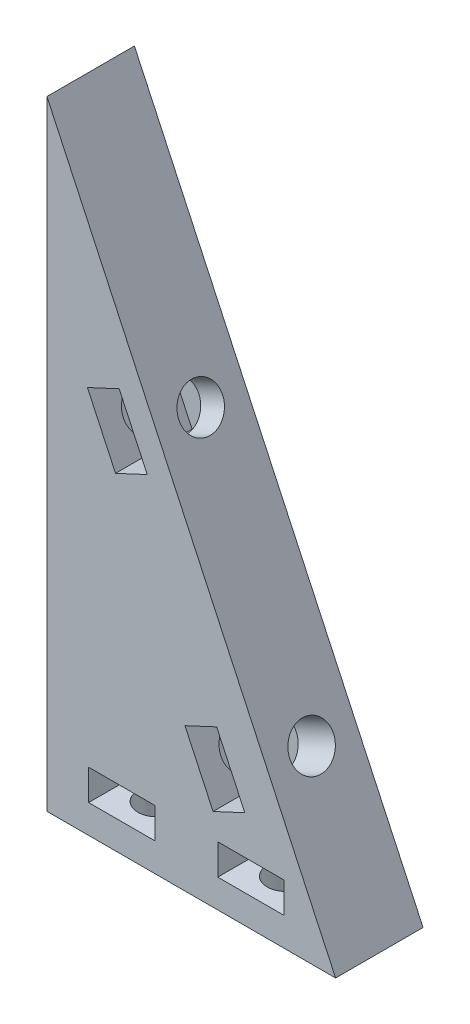
ISO-10303-21;
HEADER;
FILE_DESCRIPTION(('STEP AP214'),'2;1');
FILE_NAME('part.step','',(''),(''),'','','');
FILE_SCHEMA(('AUTOMOTIVE_DESIGN { 1 0 10303 214 1 1 1 1 }'));
ENDSEC;
DATA;
#1=APPLICATION_CONTEXT('core data for automotive mechanical design processes');
#2=APPLICATION_PROTOCOL_DEFINITION('international standard','automotive_design',2000,#1);
#3=PRODUCT_CONTEXT('',#1,'mechanical');
#4=PRODUCT('Part','Part','',(#3));
#5=PRODUCT_RELATED_PRODUCT_CATEGORY('part','',(#4));
#6=PRODUCT_DEFINITION_FORMATION('','',#4);
#7=PRODUCT_DEFINITION_CONTEXT('part definition',#1,'design');
#8=PRODUCT_DEFINITION('design','',#6,#7);
#9=PRODUCT_DEFINITION_SHAPE('','',#8);
#10=(LENGTH_UNIT() NAMED_UNIT(*) SI_UNIT(.MILLI.,.METRE.));
#11=(NAMED_UNIT(*) PLANE_ANGLE_UNIT() SI_UNIT($,.RADIAN.));
#12=(NAMED_UNIT(*) SI_UNIT($,.STERADIAN.) SOLID_ANGLE_UNIT());
#13=UNCERTAINTY_MEASURE_WITH_UNIT(LENGTH_MEASURE(1.E-05),#10,'distance_accuracy_value','');
#14=(GEOMETRIC_REPRESENTATION_CONTEXT(3) GLOBAL_UNCERTAINTY_ASSIGNED_CONTEXT((#13)) GLOBAL_UNIT_ASSIGNED_CONTEXT((#10,
#11,#12)) REPRESENTATION_CONTEXT('',''));
#15=CARTESIAN_POINT('',(0.,0.,0.));
#16=DIRECTION('',(0.,0.,1.));
#17=DIRECTION('',(1.,0.,0.));
#18=AXIS2_PLACEMENT_3D('',#15,#16,#17);
#19=CARTESIAN_POINT('',(0.,0.,10.));
#20=DIRECTION('',(0.,0.,-1.));
#21=DIRECTION('',(-1.,0.,0.));
#22=AXIS2_PLACEMENT_3D('',#19,#20,#21);
#23=PLANE('',#22);
#24=DIRECTION('',(0.,-1.,0.));
#25=VECTOR('',#24,1.);
#26=CARTESIAN_POINT('',(12.3679115650385,0.,10.));
#27=LINE('',#26,#25);
#28=CARTESIAN_POINT('',(12.3679115650385,6.75172864189274,10.));
#29=VERTEX_POINT('',#28);
#30=CARTESIAN_POINT('',(12.3679115650385,3.25172864189274,10.));
#31=VERTEX_POINT('',#30);
#32=EDGE_CURVE('E309',#29,#31,#27,.T.);
#33=ORIENTED_EDGE('',*,*,#32,.T.);
#34=DIRECTION('',(-1.,0.,0.));
#35=VECTOR('',#34,1.);
#36=CARTESIAN_POINT('',(0.,3.25172864189274,10.));
#37=LINE('',#36,#35);
#38=CARTESIAN_POINT('',(4.76791156503854,3.25172864189274,10.));
#39=VERTEX_POINT('',#38);
#40=EDGE_CURVE('E315',#31,#39,#37,.T.);
#41=ORIENTED_EDGE('',*,*,#40,.T.);
#42=DIRECTION('',(0.,1.,0.));
#43=VECTOR('',#42,1.);
#44=CARTESIAN_POINT('',(4.76791156503854,0.,10.));
#45=LINE('',#44,#43);
#46=CARTESIAN_POINT('',(4.76791156503854,6.75172864189274,10.));
#47=VERTEX_POINT('',#46);
#48=EDGE_CURVE('E332',#39,#47,#45,.T.);
#49=ORIENTED_EDGE('',*,*,#48,.T.);
#50=DIRECTION('',(1.,0.,0.));
#51=VECTOR('',#50,1.);
#52=CARTESIAN_POINT('',(0.,6.75172864189274,10.));
#53=LINE('',#52,#51);
#54=EDGE_CURVE('E328',#47,#29,#53,.T.);
#55=ORIENTED_EDGE('',*,*,#54,.T.);
#56=EDGE_LOOP('',(#33,#41,#49,#55));
#57=FACE_BOUND('',#56,.T.);
#58=DIRECTION('',(-0.422618261740704,0.906307787036648,0.));
#59=VECTOR('',#58,1.);
#60=CARTESIAN_POINT('',(33.,0.,10.));
#61=LINE('',#60,#59);
#62=CARTESIAN_POINT('',(33.,0.,10.));
#63=VERTEX_POINT('',#62);
#64=CARTESIAN_POINT('',(0.,70.7687283768145,10.));
#65=VERTEX_POINT('',#64);
#66=EDGE_CURVE('E461',#63,#65,#61,.T.);
#67=ORIENTED_EDGE('',*,*,#66,.T.);
#68=DIRECTION('',(0.,-1.,0.));
#69=VECTOR('',#68,1.);
#70=CARTESIAN_POINT('',(0.,70.7687283768145,10.));
#71=LINE('',#70,#69);
#72=CARTESIAN_POINT('',(0.,0.,10.));
#73=VERTEX_POINT('',#72);
#74=EDGE_CURVE('E465',#65,#73,#71,.T.);
#75=ORIENTED_EDGE('',*,*,#74,.T.);
#76=DIRECTION('',(1.,0.,0.));
#77=VECTOR('',#76,1.);
#78=CARTESIAN_POINT('',(0.,0.,10.));
#79=LINE('',#78,#77);
#80=EDGE_CURVE('E469',#73,#63,#79,.T.);
#81=ORIENTED_EDGE('',*,*,#80,.T.);
#82=EDGE_LOOP('',(#67,#75,#81));
#83=FACE_BOUND('',#82,.T.);
#84=DIRECTION('',(1.,0.,0.));
#85=VECTOR('',#84,1.);
#86=CARTESIAN_POINT('',(0.,6.75172864189275,10.));
#87=LINE('',#86,#85);
#88=CARTESIAN_POINT('',(19.53,6.75172864189274,10.));
#89=VERTEX_POINT('',#88);
#90=CARTESIAN_POINT('',(27.13,6.75172864189274,10.));
#91=VERTEX_POINT('',#90);
#92=EDGE_CURVE('E368',#89,#91,#87,.T.);
#93=ORIENTED_EDGE('',*,*,#92,.T.);
#94=DIRECTION('',(0.,-1.,0.));
#95=VECTOR('',#94,1.);
#96=CARTESIAN_POINT('',(27.13,0.,10.));
#97=LINE('',#96,#95);
#98=CARTESIAN_POINT('',(27.13,3.25172864189274,10.));
#99=VERTEX_POINT('',#98);
#100=EDGE_CURVE('E372',#91,#99,#97,.T.);
#101=ORIENTED_EDGE('',*,*,#100,.T.);
#102=DIRECTION('',(-1.,0.,0.));
#103=VECTOR('',#102,1.);
#104=CARTESIAN_POINT('',(0.,3.25172864189274,10.));
#105=LINE('',#104,#103);
#106=CARTESIAN_POINT('',(19.53,3.25172864189274,10.));
#107=VERTEX_POINT('',#106);
#108=EDGE_CURVE('E377',#99,#107,#105,.T.);
#109=ORIENTED_EDGE('',*,*,#108,.T.);
#110=DIRECTION('',(0.,1.,0.));
#111=VECTOR('',#110,1.);
#112=CARTESIAN_POINT('',(19.53,0.,10.));
#113=LINE('',#112,#111);
#114=EDGE_CURVE('E358',#107,#89,#113,.T.);
#115=ORIENTED_EDGE('',*,*,#114,.T.);
#116=EDGE_LOOP('',(#93,#101,#109,#115));
#117=FACE_BOUND('',#116,.T.);
#118=DIRECTION('',(0.422618261740704,-0.906307787036648,0.));
#119=VECTOR('',#118,1.);
#120=CARTESIAN_POINT('',(19.2322650192959,8.96815246216427,10.));
#121=LINE('',#120,#119);
#122=CARTESIAN_POINT('',(15.7802135690953,16.3711006870743,10.));
#123=VERTEX_POINT('',#122);
#124=CARTESIAN_POINT('',(18.9921123583246,9.48316150559582,10.));
#125=VERTEX_POINT('',#124);
#126=EDGE_CURVE('E283',#123,#125,#121,.T.);
#127=ORIENTED_EDGE('',*,*,#126,.F.);
#128=DIRECTION('',(-0.906307787036648,-0.422618261740703,0.));
#129=VECTOR('',#128,1.);
#130=CARTESIAN_POINT('',(-3.45205145020057,7.40294822491009,10.));
#131=LINE('',#130,#129);
#132=CARTESIAN_POINT('',(19.4054447172419,18.0615737340372,10.));
#133=VERTEX_POINT('',#132);
#134=EDGE_CURVE('E67',#133,#123,#131,.T.);
#135=ORIENTED_EDGE('',*,*,#134,.F.);
#136=DIRECTION('',(-0.422618261740704,0.906307787036648,0.));
#137=VECTOR('',#136,1.);
#138=CARTESIAN_POINT('',(22.8574961674425,10.6586255091271,10.));
#139=LINE('',#138,#137);
#140=CARTESIAN_POINT('',(22.6173435064713,11.1736345525587,10.));
#141=VERTEX_POINT('',#140);
#142=EDGE_CURVE('E269',#141,#133,#139,.T.);
#143=ORIENTED_EDGE('',*,*,#142,.F.);
#144=DIRECTION('',(-0.906307787036646,-0.422618261740707,0.));
#145=VECTOR('',#144,1.);
#146=CARTESIAN_POINT('',(-0.240152660971188,0.515009043431487,10.));
#147=LINE('',#146,#145);
#148=EDGE_CURVE('E288',#141,#125,#147,.T.);
#149=ORIENTED_EDGE('',*,*,#148,.T.);
#150=EDGE_LOOP('',(#127,#135,#143,#149));
#151=FACE_BOUND('',#150,.T.);
#152=DIRECTION('',(0.422618261740717,-0.906307787036642,0.));
#153=VECTOR('',#152,1.);
#154=CARTESIAN_POINT('',(24.3870721987181,11.3718785262417,10.));
#155=LINE('',#154,#153);
#156=CARTESIAN_POINT('',(8.25647289629605,45.9640603622506,10.));
#157=VERTEX_POINT('',#156);
#158=CARTESIAN_POINT('',(11.4683716855255,39.0761211807721,10.));
#159=VERTEX_POINT('',#158);
#160=EDGE_CURVE('E59',#157,#159,#155,.T.);
#161=ORIENTED_EDGE('',*,*,#160,.T.);
#162=DIRECTION('',(0.906307787036644,0.422618261740713,0.));
#163=VECTOR('',#162,1.);
#164=CARTESIAN_POINT('',(-12.9187005131925,27.7042426545306,10.));
#165=LINE('',#164,#163);
#166=CARTESIAN_POINT('',(7.84314053737891,37.3856481338093,10.));
#167=VERTEX_POINT('',#166);
#168=EDGE_CURVE('E229',#167,#159,#165,.T.);
#169=ORIENTED_EDGE('',*,*,#168,.F.);
#170=DIRECTION('',(0.422618261740721,-0.90630778703664,0.));
#171=VECTOR('',#170,1.);
#172=CARTESIAN_POINT('',(20.7618410505716,9.68140547927894,10.));
#173=LINE('',#172,#171);
#174=CARTESIAN_POINT('',(4.63124174814944,44.2735873152877,10.));
#175=VERTEX_POINT('',#174);
#176=EDGE_CURVE('E248',#175,#167,#173,.T.);
#177=ORIENTED_EDGE('',*,*,#176,.F.);
#178=DIRECTION('',(-0.906307787036644,-0.422618261740711,0.));
#179=VECTOR('',#178,1.);
#180=CARTESIAN_POINT('',(-16.1305993024219,34.5921818360092,10.));
#181=LINE('',#180,#179);
#182=EDGE_CURVE('E244',#157,#175,#181,.T.);
#183=ORIENTED_EDGE('',*,*,#182,.F.);
#184=EDGE_LOOP('',(#161,#169,#177,#183));
#185=FACE_BOUND('',#184,.T.);
#186=ADVANCED_FACE('F41',(#57,#83,#117,#151,#185),#23,.F.);
#187=CARTESIAN_POINT('',(8.55,12.,6.));
#188=DIRECTION('',(0.,-1.,0.));
#189=DIRECTION('',(1.,0.,0.));
#190=AXIS2_PLACEMENT_3D('',#187,#188,#189);
#191=CYLINDRICAL_SURFACE('',#190,2.15);
#192=CARTESIAN_POINT('',(8.55,0.,6.));
#193=DIRECTION('',(0.,-1.,0.));
#194=DIRECTION('',(1.,0.,0.));
#195=AXIS2_PLACEMENT_3D('',#192,#193,#194);
#196=CIRCLE('',#195,2.15);
#197=CARTESIAN_POINT('',(10.7,0.,6.));
#198=VERTEX_POINT('',#197);
#199=EDGE_CURVE('E411',#198,#198,#196,.T.);
#200=ORIENTED_EDGE('',*,*,#199,.T.);
#201=EDGE_LOOP('',(#200));
#202=FACE_BOUND('',#201,.T.);
#203=CARTESIAN_POINT('',(8.55,3.25172864189274,6.));
#204=DIRECTION('',(0.,1.,0.));
#205=DIRECTION('',(0.,0.,1.));
#206=AXIS2_PLACEMENT_3D('',#203,#204,#205);
#207=CIRCLE('',#206,2.15);
#208=CARTESIAN_POINT('',(8.55,3.25172864189274,8.15));
#209=VERTEX_POINT('',#208);
#210=EDGE_CURVE('E373',#209,#209,#207,.F.);
#211=ORIENTED_EDGE('',*,*,#210,.F.);
#212=EDGE_LOOP('',(#211));
#213=FACE_BOUND('',#212,.T.);
#214=ADVANCED_FACE('F563',(#202,#213),#191,.F.);
#215=CARTESIAN_POINT('',(23.33,12.,6.));
#216=DIRECTION('',(0.,-1.,0.));
#217=DIRECTION('',(1.,0.,0.));
#218=AXIS2_PLACEMENT_3D('',#215,#216,#217);
#219=CYLINDRICAL_SURFACE('',#218,2.15);
#220=CARTESIAN_POINT('',(23.33,0.,6.));
#221=DIRECTION('',(0.,-1.,0.));
#222=DIRECTION('',(1.,0.,0.));
#223=AXIS2_PLACEMENT_3D('',#220,#221,#222);
#224=CIRCLE('',#223,2.15);
#225=CARTESIAN_POINT('',(25.48,0.,6.));
#226=VERTEX_POINT('',#225);
#227=EDGE_CURVE('E403',#226,#226,#224,.T.);
#228=ORIENTED_EDGE('',*,*,#227,.T.);
#229=EDGE_LOOP('',(#228));
#230=FACE_BOUND('',#229,.T.);
#231=CARTESIAN_POINT('',(23.33,3.25172864189274,6.));
#232=DIRECTION('',(0.,1.,0.));
#233=DIRECTION('',(0.,0.,1.));
#234=AXIS2_PLACEMENT_3D('',#231,#232,#233);
#235=CIRCLE('',#234,2.15);
#236=CARTESIAN_POINT('',(23.33,3.25172864189274,8.15));
#237=VERTEX_POINT('',#236);
#238=EDGE_CURVE('E397',#237,#237,#235,.F.);
#239=ORIENTED_EDGE('',*,*,#238,.F.);
#240=EDGE_LOOP('',(#239));
#241=FACE_BOUND('',#240,.T.);
#242=ADVANCED_FACE('F569',(#230,#241),#219,.F.);
#243=CARTESIAN_POINT('',(0.,0.,10.));
#244=DIRECTION('',(0.,1.,0.));
#245=DIRECTION('',(0.,0.,1.));
#246=AXIS2_PLACEMENT_3D('',#243,#244,#245);
#247=PLANE('',#246);
#248=ORIENTED_EDGE('',*,*,#227,.F.);
#249=EDGE_LOOP('',(#248));
#250=FACE_BOUND('',#249,.T.);
#251=ORIENTED_EDGE('',*,*,#199,.F.);
#252=EDGE_LOOP('',(#251));
#253=FACE_BOUND('',#252,.T.);
#254=DIRECTION('',(1.,0.,0.));
#255=VECTOR('',#254,1.);
#256=CARTESIAN_POINT('',(0.,0.,0.));
#257=LINE('',#256,#255);
#258=CARTESIAN_POINT('',(0.,0.,0.));
#259=VERTEX_POINT('',#258);
#260=CARTESIAN_POINT('',(33.,0.,0.));
#261=VERTEX_POINT('',#260);
#262=EDGE_CURVE('E466',#259,#261,#257,.T.);
#263=ORIENTED_EDGE('',*,*,#262,.T.);
#264=DIRECTION('',(0.,0.,-1.));
#265=VECTOR('',#264,1.);
#266=CARTESIAN_POINT('',(33.,0.,10.));
#267=LINE('',#266,#265);
#268=EDGE_CURVE('E472',#63,#261,#267,.T.);
#269=ORIENTED_EDGE('',*,*,#268,.F.);
#270=ORIENTED_EDGE('',*,*,#80,.F.);
#271=DIRECTION('',(0.,0.,-1.));
#272=VECTOR('',#271,1.);
#273=CARTESIAN_POINT('',(0.,0.,10.));
#274=LINE('',#273,#272);
#275=EDGE_CURVE('E484',#73,#259,#274,.T.);
#276=ORIENTED_EDGE('',*,*,#275,.T.);
#277=EDGE_LOOP('',(#263,#269,#270,#276));
#278=FACE_BOUND('',#277,.T.);
#279=DIRECTION('',(0.,0.,1.));
#280=VECTOR('',#279,1.);
#281=CARTESIAN_POINT('',(19.4,0.,6.9));
#282=LINE('',#281,#280);
#283=CARTESIAN_POINT('',(19.4,0.,3.1));
#284=VERTEX_POINT('',#283);
#285=CARTESIAN_POINT('',(19.4,0.,6.9));
#286=VERTEX_POINT('',#285);
#287=EDGE_CURVE('E402',#284,#286,#282,.T.);
#288=ORIENTED_EDGE('',*,*,#287,.F.);
#289=DIRECTION('',(1.,0.,0.));
#290=VECTOR('',#289,1.);
#291=CARTESIAN_POINT('',(13.6,0.,3.1));
#292=LINE('',#291,#290);
#293=CARTESIAN_POINT('',(13.6,0.,3.1));
#294=VERTEX_POINT('',#293);
#295=EDGE_CURVE('E421',#294,#284,#292,.T.);
#296=ORIENTED_EDGE('',*,*,#295,.F.);
#297=DIRECTION('',(0.,0.,-1.));
#298=VECTOR('',#297,1.);
#299=CARTESIAN_POINT('',(13.6,0.,6.9));
#300=LINE('',#299,#298);
#301=CARTESIAN_POINT('',(13.6,0.,6.9));
#302=VERTEX_POINT('',#301);
#303=EDGE_CURVE('E438',#302,#294,#300,.T.);
#304=ORIENTED_EDGE('',*,*,#303,.F.);
#305=DIRECTION('',(-1.,0.,0.));
#306=VECTOR('',#305,1.);
#307=CARTESIAN_POINT('',(13.6,0.,6.9));
#308=LINE('',#307,#306);
#309=EDGE_CURVE('E434',#286,#302,#308,.T.);
#310=ORIENTED_EDGE('',*,*,#309,.F.);
#311=EDGE_LOOP('',(#288,#296,#304,#310));
#312=FACE_BOUND('',#311,.T.);
#313=ADVANCED_FACE('F583',(#250,#253,#278,#312),#247,.F.);
#314=CARTESIAN_POINT('',(33.,0.,10.));
#315=DIRECTION('',(-0.906307787036648,-0.422618261740704,0.));
#316=DIRECTION('',(0.422618261740704,-0.906307787036648,0.));
#317=AXIS2_PLACEMENT_3D('',#314,#315,#316);
#318=PLANE('',#317);
#319=CARTESIAN_POINT('',(12.5813456520208,43.7879455567335,5.));
#320=DIRECTION('',(0.906307787036648,0.422618261740704,0.));
#321=DIRECTION('',(-0.422618261740704,0.906307787036648,0.));
#322=AXIS2_PLACEMENT_3D('',#319,#320,#321);
#323=CIRCLE('',#322,2.5);
#324=CARTESIAN_POINT('',(11.524799997669,46.0537150243251,5.));
#325=VERTEX_POINT('',#324);
#326=EDGE_CURVE('E520',#325,#325,#323,.T.);
#327=ORIENTED_EDGE('',*,*,#326,.F.);
#328=EDGE_LOOP('',(#327));
#329=FACE_BOUND('',#328,.T.);
#330=CARTESIAN_POINT('',(25.2598935042419,16.5987119456341,4.99999999999999));
#331=DIRECTION('',(0.906307787036648,0.422618261740704,0.));
#332=DIRECTION('',(-0.422618261740704,0.906307787036648,0.));
#333=AXIS2_PLACEMENT_3D('',#330,#331,#332);
#334=CIRCLE('',#333,2.5);
#335=CARTESIAN_POINT('',(24.2033478498901,18.8644814132257,4.99999999999999));
#336=VERTEX_POINT('',#335);
#337=EDGE_CURVE('E532',#336,#336,#334,.T.);
#338=ORIENTED_EDGE('',*,*,#337,.F.);
#339=EDGE_LOOP('',(#338));
#340=FACE_BOUND('',#339,.T.);
#341=DIRECTION('',(-0.422618261740704,0.906307787036648,0.));
#342=VECTOR('',#341,1.);
#343=CARTESIAN_POINT('',(33.,0.,0.));
#344=LINE('',#343,#342);
#345=CARTESIAN_POINT('',(0.,70.7687283768145,0.));
#346=VERTEX_POINT('',#345);
#347=EDGE_CURVE('E460',#261,#346,#344,.T.);
#348=ORIENTED_EDGE('',*,*,#347,.T.);
#349=DIRECTION('',(0.,0.,-1.));
#350=VECTOR('',#349,1.);
#351=CARTESIAN_POINT('',(0.,70.7687283768145,10.));
#352=LINE('',#351,#350);
#353=EDGE_CURVE('E488',#65,#346,#352,.T.);
#354=ORIENTED_EDGE('',*,*,#353,.F.);
#355=ORIENTED_EDGE('',*,*,#66,.F.);
#356=ORIENTED_EDGE('',*,*,#268,.T.);
#357=EDGE_LOOP('',(#348,#354,#355,#356));
#358=FACE_BOUND('',#357,.T.);
#359=ADVANCED_FACE('F43',(#329,#340,#358),#318,.F.);
#360=CARTESIAN_POINT('',(0.,70.7687283768145,10.));
#361=DIRECTION('',(1.,0.,0.));
#362=DIRECTION('',(0.,1.,0.));
#363=AXIS2_PLACEMENT_3D('',#360,#361,#362);
#364=PLANE('',#363);
#365=DIRECTION('',(0.,-1.,0.));
#366=VECTOR('',#365,1.);
#367=CARTESIAN_POINT('',(0.,70.7687283768145,0.));
#368=LINE('',#367,#366);
#369=EDGE_CURVE('E476',#346,#259,#368,.T.);
#370=ORIENTED_EDGE('',*,*,#369,.T.);
#371=ORIENTED_EDGE('',*,*,#275,.F.);
#372=ORIENTED_EDGE('',*,*,#74,.F.);
#373=ORIENTED_EDGE('',*,*,#353,.T.);
#374=EDGE_LOOP('',(#370,#371,#372,#373));
#375=FACE_BOUND('',#374,.T.);
#376=ADVANCED_FACE('F581',(#375),#364,.F.);
#377=CARTESIAN_POINT('',(0.,0.,0.));
#378=DIRECTION('',(0.,0.,-1.));
#379=DIRECTION('',(-1.,0.,0.));
#380=AXIS2_PLACEMENT_3D('',#377,#378,#379);
#381=PLANE('',#380);
#382=ORIENTED_EDGE('',*,*,#347,.F.);
#383=ORIENTED_EDGE('',*,*,#262,.F.);
#384=ORIENTED_EDGE('',*,*,#369,.F.);
#385=EDGE_LOOP('',(#382,#383,#384));
#386=FACE_BOUND('',#385,.T.);
#387=ADVANCED_FACE('F578',(#386),#381,.T.);
#388=CARTESIAN_POINT('',(19.4,-2.,6.9));
#389=DIRECTION('',(-1.,0.,0.));
#390=DIRECTION('',(0.,-1.,0.));
#391=AXIS2_PLACEMENT_3D('',#388,#389,#390);
#392=PLANE('',#391);
#393=ORIENTED_EDGE('',*,*,#287,.T.);
#394=DIRECTION('',(0.,1.,0.));
#395=VECTOR('',#394,1.);
#396=CARTESIAN_POINT('',(19.4,-2.,6.9));
#397=LINE('',#396,#395);
#398=CARTESIAN_POINT('',(19.4,-2.,6.9));
#399=VERTEX_POINT('',#398);
#400=EDGE_CURVE('E456',#399,#286,#397,.T.);
#401=ORIENTED_EDGE('',*,*,#400,.F.);
#402=DIRECTION('',(0.,0.,1.));
#403=VECTOR('',#402,1.);
#404=CARTESIAN_POINT('',(19.4,-2.,6.9));
#405=LINE('',#404,#403);
#406=CARTESIAN_POINT('',(19.4,-2.,3.1));
#407=VERTEX_POINT('',#406);
#408=EDGE_CURVE('E416',#407,#399,#405,.T.);
#409=ORIENTED_EDGE('',*,*,#408,.F.);
#410=DIRECTION('',(0.,1.,0.));
#411=VECTOR('',#410,1.);
#412=CARTESIAN_POINT('',(19.4,-2.,3.1));
#413=LINE('',#412,#411);
#414=EDGE_CURVE('E430',#407,#284,#413,.T.);
#415=ORIENTED_EDGE('',*,*,#414,.T.);
#416=EDGE_LOOP('',(#393,#401,#409,#415));
#417=FACE_BOUND('',#416,.T.);
#418=ADVANCED_FACE('F576',(#417),#392,.F.);
#419=CARTESIAN_POINT('',(13.6,-2.,6.9));
#420=DIRECTION('',(0.,0.,-1.));
#421=DIRECTION('',(-1.,0.,0.));
#422=AXIS2_PLACEMENT_3D('',#419,#420,#421);
#423=PLANE('',#422);
#424=ORIENTED_EDGE('',*,*,#309,.T.);
#425=DIRECTION('',(0.,1.,0.));
#426=VECTOR('',#425,1.);
#427=CARTESIAN_POINT('',(13.6,-2.,6.9));
#428=LINE('',#427,#426);
#429=CARTESIAN_POINT('',(13.6,-2.,6.9));
#430=VERTEX_POINT('',#429);
#431=EDGE_CURVE('E452',#430,#302,#428,.T.);
#432=ORIENTED_EDGE('',*,*,#431,.F.);
#433=DIRECTION('',(-1.,0.,0.));
#434=VECTOR('',#433,1.);
#435=CARTESIAN_POINT('',(13.6,-2.,6.9));
#436=LINE('',#435,#434);
#437=EDGE_CURVE('E420',#399,#430,#436,.T.);
#438=ORIENTED_EDGE('',*,*,#437,.F.);
#439=ORIENTED_EDGE('',*,*,#400,.T.);
#440=EDGE_LOOP('',(#424,#432,#438,#439));
#441=FACE_BOUND('',#440,.T.);
#442=ADVANCED_FACE('F702',(#441),#423,.F.);
#443=CARTESIAN_POINT('',(13.6,-2.,6.9));
#444=DIRECTION('',(1.,0.,0.));
#445=DIRECTION('',(0.,1.,0.));
#446=AXIS2_PLACEMENT_3D('',#443,#444,#445);
#447=PLANE('',#446);
#448=ORIENTED_EDGE('',*,*,#303,.T.);
#449=DIRECTION('',(0.,1.,0.));
#450=VECTOR('',#449,1.);
#451=CARTESIAN_POINT('',(13.6,-2.,3.1));
#452=LINE('',#451,#450);
#453=CARTESIAN_POINT('',(13.6,-2.,3.1));
#454=VERTEX_POINT('',#453);
#455=EDGE_CURVE('E448',#454,#294,#452,.T.);
#456=ORIENTED_EDGE('',*,*,#455,.F.);
#457=DIRECTION('',(0.,0.,-1.));
#458=VECTOR('',#457,1.);
#459=CARTESIAN_POINT('',(13.6,-2.,6.9));
#460=LINE('',#459,#458);
#461=EDGE_CURVE('E424',#430,#454,#460,.T.);
#462=ORIENTED_EDGE('',*,*,#461,.F.);
#463=ORIENTED_EDGE('',*,*,#431,.T.);
#464=EDGE_LOOP('',(#448,#456,#462,#463));
#465=FACE_BOUND('',#464,.T.);
#466=ADVANCED_FACE('F699',(#465),#447,.F.);
#467=CARTESIAN_POINT('',(13.6,-2.,3.1));
#468=DIRECTION('',(0.,0.,1.));
#469=DIRECTION('',(1.,0.,0.));
#470=AXIS2_PLACEMENT_3D('',#467,#468,#469);
#471=PLANE('',#470);
#472=ORIENTED_EDGE('',*,*,#295,.T.);
#473=ORIENTED_EDGE('',*,*,#414,.F.);
#474=DIRECTION('',(1.,0.,0.));
#475=VECTOR('',#474,1.);
#476=CARTESIAN_POINT('',(13.6,-2.,3.1));
#477=LINE('',#476,#475);
#478=EDGE_CURVE('E427',#454,#407,#477,.T.);
#479=ORIENTED_EDGE('',*,*,#478,.F.);
#480=ORIENTED_EDGE('',*,*,#455,.T.);
#481=EDGE_LOOP('',(#472,#473,#479,#480));
#482=FACE_BOUND('',#481,.T.);
#483=ADVANCED_FACE('F695',(#482),#471,.F.);
#484=CARTESIAN_POINT('',(0.,-2.,0.));
#485=DIRECTION('',(0.,-1.,0.));
#486=DIRECTION('',(1.,0.,0.));
#487=AXIS2_PLACEMENT_3D('',#484,#485,#486);
#488=PLANE('',#487);
#489=ORIENTED_EDGE('',*,*,#408,.T.);
#490=ORIENTED_EDGE('',*,*,#437,.T.);
#491=ORIENTED_EDGE('',*,*,#461,.T.);
#492=ORIENTED_EDGE('',*,*,#478,.T.);
#493=EDGE_LOOP('',(#489,#490,#491,#492));
#494=FACE_BOUND('',#493,.T.);
#495=ADVANCED_FACE('F682',(#494),#488,.T.);
#496=CARTESIAN_POINT('',(0.,6.75172864189275,1.25));
#497=DIRECTION('',(0.,-1.,0.));
#498=DIRECTION('',(1.,0.,0.));
#499=AXIS2_PLACEMENT_3D('',#496,#497,#498);
#500=PLANE('',#499);
#501=ORIENTED_EDGE('',*,*,#92,.F.);
#502=DIRECTION('',(0.,0.,1.));
#503=VECTOR('',#502,1.);
#504=CARTESIAN_POINT('',(19.53,6.75172864189274,1.25));
#505=LINE('',#504,#503);
#506=CARTESIAN_POINT('',(19.53,6.75172864189274,1.25));
#507=VERTEX_POINT('',#506);
#508=EDGE_CURVE('E367',#507,#89,#505,.T.);
#509=ORIENTED_EDGE('',*,*,#508,.F.);
#510=DIRECTION('',(1.,0.,0.));
#511=VECTOR('',#510,1.);
#512=CARTESIAN_POINT('',(0.,6.75172864189275,1.25));
#513=LINE('',#512,#511);
#514=CARTESIAN_POINT('',(27.13,6.75172864189274,1.25));
#515=VERTEX_POINT('',#514);
#516=EDGE_CURVE('E353',#507,#515,#513,.T.);
#517=ORIENTED_EDGE('',*,*,#516,.T.);
#518=DIRECTION('',(0.,0.,1.));
#519=VECTOR('',#518,1.);
#520=CARTESIAN_POINT('',(27.13,6.75172864189274,1.25));
#521=LINE('',#520,#519);
#522=EDGE_CURVE('E393',#515,#91,#521,.T.);
#523=ORIENTED_EDGE('',*,*,#522,.T.);
#524=EDGE_LOOP('',(#501,#509,#517,#523));
#525=FACE_BOUND('',#524,.T.);
#526=CARTESIAN_POINT('',(23.33,6.75172864189274,6.));
#527=DIRECTION('',(0.,-1.,0.));
#528=DIRECTION('',(1.,0.,0.));
#529=AXIS2_PLACEMENT_3D('',#526,#527,#528);
#530=CIRCLE('',#529,2.15);
#531=CARTESIAN_POINT('',(25.48,6.75172864189274,6.));
#532=VERTEX_POINT('',#531);
#533=EDGE_CURVE('E415',#532,#532,#530,.F.);
#534=ORIENTED_EDGE('',*,*,#533,.T.);
#535=EDGE_LOOP('',(#534));
#536=FACE_BOUND('',#535,.T.);
#537=ADVANCED_FACE('F675',(#525,#536),#500,.T.);
#538=CARTESIAN_POINT('',(0.,3.25172864189274,1.25));
#539=DIRECTION('',(0.,1.,0.));
#540=DIRECTION('',(0.,0.,1.));
#541=AXIS2_PLACEMENT_3D('',#538,#539,#540);
#542=PLANE('',#541);
#543=ORIENTED_EDGE('',*,*,#108,.F.);
#544=DIRECTION('',(0.,0.,1.));
#545=VECTOR('',#544,1.);
#546=CARTESIAN_POINT('',(27.13,3.25172864189274,1.25));
#547=LINE('',#546,#545);
#548=CARTESIAN_POINT('',(27.13,3.25172864189274,1.25));
#549=VERTEX_POINT('',#548);
#550=EDGE_CURVE('E390',#549,#99,#547,.T.);
#551=ORIENTED_EDGE('',*,*,#550,.F.);
#552=DIRECTION('',(-1.,0.,0.));
#553=VECTOR('',#552,1.);
#554=CARTESIAN_POINT('',(0.,3.25172864189274,1.25));
#555=LINE('',#554,#553);
#556=CARTESIAN_POINT('',(19.53,3.25172864189274,1.25));
#557=VERTEX_POINT('',#556);
#558=EDGE_CURVE('E361',#549,#557,#555,.T.);
#559=ORIENTED_EDGE('',*,*,#558,.T.);
#560=DIRECTION('',(0.,0.,1.));
#561=VECTOR('',#560,1.);
#562=CARTESIAN_POINT('',(19.53,3.25172864189274,1.25));
#563=LINE('',#562,#561);
#564=EDGE_CURVE('E387',#557,#107,#563,.T.);
#565=ORIENTED_EDGE('',*,*,#564,.T.);
#566=EDGE_LOOP('',(#543,#551,#559,#565));
#567=FACE_BOUND('',#566,.T.);
#568=ORIENTED_EDGE('',*,*,#238,.T.);
#569=EDGE_LOOP('',(#568));
#570=FACE_BOUND('',#569,.T.);
#571=ADVANCED_FACE('F672',(#567,#570),#542,.T.);
#572=CARTESIAN_POINT('',(27.13,0.,1.25));
#573=DIRECTION('',(-1.,0.,0.));
#574=DIRECTION('',(0.,0.,1.));
#575=AXIS2_PLACEMENT_3D('',#572,#573,#574);
#576=PLANE('',#575);
#577=ORIENTED_EDGE('',*,*,#100,.F.);
#578=ORIENTED_EDGE('',*,*,#522,.F.);
#579=DIRECTION('',(0.,-1.,0.));
#580=VECTOR('',#579,1.);
#581=CARTESIAN_POINT('',(27.13,0.,1.25));
#582=LINE('',#581,#580);
#583=EDGE_CURVE('E357',#515,#549,#582,.T.);
#584=ORIENTED_EDGE('',*,*,#583,.T.);
#585=ORIENTED_EDGE('',*,*,#550,.T.);
#586=EDGE_LOOP('',(#577,#578,#584,#585));
#587=FACE_BOUND('',#586,.T.);
#588=ADVANCED_FACE('F670',(#587),#576,.T.);
#589=CARTESIAN_POINT('',(19.53,0.,1.25));
#590=DIRECTION('',(1.,0.,0.));
#591=DIRECTION('',(0.,0.,-1.));
#592=AXIS2_PLACEMENT_3D('',#589,#590,#591);
#593=PLANE('',#592);
#594=ORIENTED_EDGE('',*,*,#114,.F.);
#595=ORIENTED_EDGE('',*,*,#564,.F.);
#596=DIRECTION('',(0.,1.,0.));
#597=VECTOR('',#596,1.);
#598=CARTESIAN_POINT('',(19.53,0.,1.25));
#599=LINE('',#598,#597);
#600=EDGE_CURVE('E364',#557,#507,#599,.T.);
#601=ORIENTED_EDGE('',*,*,#600,.T.);
#602=ORIENTED_EDGE('',*,*,#508,.T.);
#603=EDGE_LOOP('',(#594,#595,#601,#602));
#604=FACE_BOUND('',#603,.T.);
#605=ADVANCED_FACE('F666',(#604),#593,.T.);
#606=CARTESIAN_POINT('',(0.,0.,1.25));
#607=DIRECTION('',(0.,0.,-1.));
#608=DIRECTION('',(-1.,0.,0.));
#609=AXIS2_PLACEMENT_3D('',#606,#607,#608);
#610=PLANE('',#609);
#611=ORIENTED_EDGE('',*,*,#516,.F.);
#612=ORIENTED_EDGE('',*,*,#600,.F.);
#613=ORIENTED_EDGE('',*,*,#558,.F.);
#614=ORIENTED_EDGE('',*,*,#583,.F.);
#615=EDGE_LOOP('',(#611,#612,#613,#614));
#616=FACE_BOUND('',#615,.T.);
#617=ADVANCED_FACE('F662',(#616),#610,.F.);
#618=CARTESIAN_POINT('',(23.33,12.,6.));
#619=DIRECTION('',(0.,-1.,0.));
#620=DIRECTION('',(1.,0.,0.));
#621=AXIS2_PLACEMENT_3D('',#618,#619,#620);
#622=PLANE('',#621);
#623=DIRECTION('',(0.,0.,1.));
#624=VECTOR('',#623,1.);
#625=CARTESIAN_POINT('',(22.2320029698946,12.,6.));
#626=LINE('',#625,#624);
#627=CARTESIAN_POINT('',(22.2320029698946,12.,4.1515134509876));
#628=VERTEX_POINT('',#627);
#629=CARTESIAN_POINT('',(22.2320029698946,12.,7.84848654901241));
#630=VERTEX_POINT('',#629);
#631=EDGE_CURVE('E258',#628,#630,#626,.T.);
#632=ORIENTED_EDGE('',*,*,#631,.F.);
#633=CARTESIAN_POINT('',(23.33,12.,6.));
#634=DIRECTION('',(0.,-1.,0.));
#635=DIRECTION('',(1.,0.,0.));
#636=AXIS2_PLACEMENT_3D('',#633,#634,#635);
#637=CIRCLE('',#636,2.15);
#638=EDGE_CURVE('E398',#628,#630,#637,.T.);
#639=ORIENTED_EDGE('',*,*,#638,.T.);
#640=EDGE_LOOP('',(#632,#639));
#641=FACE_BOUND('',#640,.T.);
#642=ADVANCED_FACE('F665',(#641),#622,.T.);
#643=CARTESIAN_POINT('',(23.33,11.505951733125,6.));
#644=DIRECTION('',(-0.422618261740707,0.906307787036646,0.));
#645=DIRECTION('',(-0.906307787036646,-0.422618261740707,0.));
#646=AXIS2_PLACEMENT_3D('',#643,#644,#645);
#647=ELLIPSE('',#646,2.37226252576936,2.15);
#648=CARTESIAN_POINT('',(22.6173435064713,11.1736345525587,8.02845279023972));
#649=VERTEX_POINT('',#648);
#650=CARTESIAN_POINT('',(22.6173435064713,11.1736345525587,3.97154720976028));
#651=VERTEX_POINT('',#650);
#652=EDGE_CURVE('E492',#649,#651,#647,.F.);
#653=ORIENTED_EDGE('',*,*,#652,.F.);
#654=CARTESIAN_POINT('',(23.33,9.64533777024013,6.));
#655=DIRECTION('',(0.906307787036648,0.422618261740704,0.));
#656=DIRECTION('',(0.422618261740704,-0.906307787036648,0.));
#657=AXIS2_PLACEMENT_3D('',#654,#655,#656);
#658=ELLIPSE('',#657,5.08733340377782,2.15);
#659=EDGE_CURVE('E11',#649,#630,#658,.F.);
#660=ORIENTED_EDGE('',*,*,#659,.T.);
#661=ORIENTED_EDGE('',*,*,#638,.F.);
#662=EDGE_CURVE('E51',#628,#651,#658,.F.);
#663=ORIENTED_EDGE('',*,*,#662,.T.);
#664=EDGE_LOOP('',(#653,#660,#661,#663));
#665=FACE_BOUND('',#664,.T.);
#666=ORIENTED_EDGE('',*,*,#533,.F.);
#667=EDGE_LOOP('',(#666));
#668=FACE_BOUND('',#667,.T.);
#669=ADVANCED_FACE('F650',(#665,#668),#219,.F.);
#670=CARTESIAN_POINT('',(0.,3.25172864189274,1.25));
#671=DIRECTION('',(0.,1.,0.));
#672=DIRECTION('',(0.,0.,1.));
#673=AXIS2_PLACEMENT_3D('',#670,#671,#672);
#674=PLANE('',#673);
#675=ORIENTED_EDGE('',*,*,#40,.F.);
#676=DIRECTION('',(0.,0.,1.));
#677=VECTOR('',#676,1.);
#678=CARTESIAN_POINT('',(12.3679115650385,3.25172864189274,1.25));
#679=LINE('',#678,#677);
#680=CARTESIAN_POINT('',(12.3679115650385,3.25172864189274,1.25));
#681=VERTEX_POINT('',#680);
#682=EDGE_CURVE('E339',#681,#31,#679,.T.);
#683=ORIENTED_EDGE('',*,*,#682,.F.);
#684=DIRECTION('',(-1.,0.,0.));
#685=VECTOR('',#684,1.);
#686=CARTESIAN_POINT('',(0.,3.25172864189274,1.25));
#687=LINE('',#686,#685);
#688=CARTESIAN_POINT('',(4.76791156503854,3.25172864189274,1.25));
#689=VERTEX_POINT('',#688);
#690=EDGE_CURVE('E321',#681,#689,#687,.T.);
#691=ORIENTED_EDGE('',*,*,#690,.T.);
#692=DIRECTION('',(0.,0.,1.));
#693=VECTOR('',#692,1.);
#694=CARTESIAN_POINT('',(4.76791156503854,3.25172864189274,1.25));
#695=LINE('',#694,#693);
#696=EDGE_CURVE('E344',#689,#39,#695,.T.);
#697=ORIENTED_EDGE('',*,*,#696,.T.);
#698=EDGE_LOOP('',(#675,#683,#691,#697));
#699=FACE_BOUND('',#698,.T.);
#700=ORIENTED_EDGE('',*,*,#210,.T.);
#701=EDGE_LOOP('',(#700));
#702=FACE_BOUND('',#701,.T.);
#703=ADVANCED_FACE('F646',(#699,#702),#674,.T.);
#704=CARTESIAN_POINT('',(0.,6.75172864189274,1.25));
#705=DIRECTION('',(0.,-1.,0.));
#706=DIRECTION('',(1.,0.,0.));
#707=AXIS2_PLACEMENT_3D('',#704,#705,#706);
#708=PLANE('',#707);
#709=ORIENTED_EDGE('',*,*,#54,.F.);
#710=DIRECTION('',(0.,0.,1.));
#711=VECTOR('',#710,1.);
#712=CARTESIAN_POINT('',(4.76791156503854,6.75172864189274,1.25));
#713=LINE('',#712,#711);
#714=CARTESIAN_POINT('',(4.76791156503854,6.75172864189274,1.25));
#715=VERTEX_POINT('',#714);
#716=EDGE_CURVE('E347',#715,#47,#713,.T.);
#717=ORIENTED_EDGE('',*,*,#716,.F.);
#718=DIRECTION('',(1.,0.,0.));
#719=VECTOR('',#718,1.);
#720=CARTESIAN_POINT('',(0.,6.75172864189274,1.25));
#721=LINE('',#720,#719);
#722=CARTESIAN_POINT('',(12.3679115650385,6.75172864189274,1.25));
#723=VERTEX_POINT('',#722);
#724=EDGE_CURVE('E314',#715,#723,#721,.T.);
#725=ORIENTED_EDGE('',*,*,#724,.T.);
#726=DIRECTION('',(0.,0.,1.));
#727=VECTOR('',#726,1.);
#728=CARTESIAN_POINT('',(12.3679115650385,6.75172864189274,1.25));
#729=LINE('',#728,#727);
#730=EDGE_CURVE('E324',#723,#29,#729,.T.);
#731=ORIENTED_EDGE('',*,*,#730,.T.);
#732=EDGE_LOOP('',(#709,#717,#725,#731));
#733=FACE_BOUND('',#732,.T.);
#734=CARTESIAN_POINT('',(8.55,6.75172864189274,6.));
#735=DIRECTION('',(0.,-1.,0.));
#736=DIRECTION('',(1.,0.,0.));
#737=AXIS2_PLACEMENT_3D('',#734,#735,#736);
#738=CIRCLE('',#737,2.15);
#739=CARTESIAN_POINT('',(10.7,6.75172864189274,6.));
#740=VERTEX_POINT('',#739);
#741=EDGE_CURVE('E343',#740,#740,#738,.F.);
#742=ORIENTED_EDGE('',*,*,#741,.T.);
#743=EDGE_LOOP('',(#742));
#744=FACE_BOUND('',#743,.T.);
#745=ADVANCED_FACE('F649',(#733,#744),#708,.T.);
#746=CARTESIAN_POINT('',(12.3679115650385,0.,1.25));
#747=DIRECTION('',(-1.,0.,0.));
#748=DIRECTION('',(0.,0.,1.));
#749=AXIS2_PLACEMENT_3D('',#746,#747,#748);
#750=PLANE('',#749);
#751=ORIENTED_EDGE('',*,*,#32,.F.);
#752=ORIENTED_EDGE('',*,*,#730,.F.);
#753=DIRECTION('',(0.,-1.,0.));
#754=VECTOR('',#753,1.);
#755=CARTESIAN_POINT('',(12.3679115650385,0.,1.25));
#756=LINE('',#755,#754);
#757=EDGE_CURVE('E310',#723,#681,#756,.T.);
#758=ORIENTED_EDGE('',*,*,#757,.T.);
#759=ORIENTED_EDGE('',*,*,#682,.T.);
#760=EDGE_LOOP('',(#751,#752,#758,#759));
#761=FACE_BOUND('',#760,.T.);
#762=ADVANCED_FACE('F654',(#761),#750,.T.);
#763=CARTESIAN_POINT('',(4.76791156503854,0.,1.25));
#764=DIRECTION('',(1.,0.,0.));
#765=DIRECTION('',(0.,0.,-1.));
#766=AXIS2_PLACEMENT_3D('',#763,#764,#765);
#767=PLANE('',#766);
#768=ORIENTED_EDGE('',*,*,#48,.F.);
#769=ORIENTED_EDGE('',*,*,#696,.F.);
#770=DIRECTION('',(0.,1.,0.));
#771=VECTOR('',#770,1.);
#772=CARTESIAN_POINT('',(4.76791156503854,0.,1.25));
#773=LINE('',#772,#771);
#774=EDGE_CURVE('E318',#689,#715,#773,.T.);
#775=ORIENTED_EDGE('',*,*,#774,.T.);
#776=ORIENTED_EDGE('',*,*,#716,.T.);
#777=EDGE_LOOP('',(#768,#769,#775,#776));
#778=FACE_BOUND('',#777,.T.);
#779=ADVANCED_FACE('F644',(#778),#767,.T.);
#780=CARTESIAN_POINT('',(0.,0.,1.25));
#781=DIRECTION('',(0.,0.,1.));
#782=DIRECTION('',(1.,0.,0.));
#783=AXIS2_PLACEMENT_3D('',#780,#781,#782);
#784=PLANE('',#783);
#785=ORIENTED_EDGE('',*,*,#757,.F.);
#786=ORIENTED_EDGE('',*,*,#724,.F.);
#787=ORIENTED_EDGE('',*,*,#774,.F.);
#788=ORIENTED_EDGE('',*,*,#690,.F.);
#789=EDGE_LOOP('',(#785,#786,#787,#788));
#790=FACE_BOUND('',#789,.T.);
#791=ADVANCED_FACE('F640',(#790),#784,.T.);
#792=CARTESIAN_POINT('',(8.55,12.,6.));
#793=DIRECTION('',(0.,-1.,0.));
#794=DIRECTION('',(1.,0.,0.));
#795=AXIS2_PLACEMENT_3D('',#792,#793,#794);
#796=PLANE('',#795);
#797=CARTESIAN_POINT('',(8.55,12.,6.));
#798=DIRECTION('',(0.,-1.,0.));
#799=DIRECTION('',(1.,0.,0.));
#800=AXIS2_PLACEMENT_3D('',#797,#798,#799);
#801=CIRCLE('',#800,2.15);
#802=CARTESIAN_POINT('',(10.7,12.,6.));
#803=VERTEX_POINT('',#802);
#804=EDGE_CURVE('E407',#803,#803,#801,.T.);
#805=ORIENTED_EDGE('',*,*,#804,.T.);
#806=EDGE_LOOP('',(#805));
#807=FACE_BOUND('',#806,.T.);
#808=ADVANCED_FACE('F643',(#807),#796,.T.);
#809=ORIENTED_EDGE('',*,*,#804,.F.);
#810=EDGE_LOOP('',(#809));
#811=FACE_BOUND('',#810,.T.);
#812=ORIENTED_EDGE('',*,*,#741,.F.);
#813=EDGE_LOOP('',(#812));
#814=FACE_BOUND('',#813,.T.);
#815=ADVANCED_FACE('F572',(#811,#814),#191,.F.);
#816=CARTESIAN_POINT('',(22.8574961674425,10.6586255091271,1.25));
#817=DIRECTION('',(0.906307787036648,0.422618261740704,0.));
#818=DIRECTION('',(-0.422618261740704,0.906307787036648,0.));
#819=AXIS2_PLACEMENT_3D('',#816,#817,#818);
#820=PLANE('',#819);
#821=CARTESIAN_POINT('',(21.0113941118566,14.6176041432979,4.99999999999999));
#822=DIRECTION('',(0.906307787036648,0.422618261740704,0.));
#823=DIRECTION('',(-0.422618261740704,0.906307787036648,0.));
#824=AXIS2_PLACEMENT_3D('',#821,#822,#823);
#825=CIRCLE('',#824,2.5);
#826=CARTESIAN_POINT('',(19.9548484575048,16.8833736108895,4.99999999999999));
#827=VERTEX_POINT('',#826);
#828=EDGE_CURVE('E284',#827,#827,#825,.T.);
#829=ORIENTED_EDGE('',*,*,#828,.T.);
#830=EDGE_LOOP('',(#829));
#831=FACE_BOUND('',#830,.T.);
#832=DIRECTION('',(0.,0.,1.));
#833=VECTOR('',#832,1.);
#834=CARTESIAN_POINT('',(22.6173435064713,11.1736345525587,1.25));
#835=LINE('',#834,#833);
#836=EDGE_CURVE('E301',#649,#141,#835,.T.);
#837=ORIENTED_EDGE('',*,*,#836,.T.);
#838=ORIENTED_EDGE('',*,*,#142,.T.);
#839=DIRECTION('',(0.,0.,1.));
#840=VECTOR('',#839,1.);
#841=CARTESIAN_POINT('',(19.4054447172419,18.0615737340372,1.25));
#842=LINE('',#841,#840);
#843=CARTESIAN_POINT('',(19.4054447172419,18.0615737340372,1.25));
#844=VERTEX_POINT('',#843);
#845=EDGE_CURVE('E245',#844,#133,#842,.T.);
#846=ORIENTED_EDGE('',*,*,#845,.F.);
#847=DIRECTION('',(-0.422618261740704,0.906307787036648,0.));
#848=VECTOR('',#847,1.);
#849=CARTESIAN_POINT('',(22.8574961674425,10.6586255091271,1.25));
#850=LINE('',#849,#848);
#851=CARTESIAN_POINT('',(22.6173435064713,11.1736345525587,1.25));
#852=VERTEX_POINT('',#851);
#853=EDGE_CURVE('E276',#852,#844,#850,.T.);
#854=ORIENTED_EDGE('',*,*,#853,.F.);
#855=EDGE_CURVE('E297',#852,#651,#835,.T.);
#856=ORIENTED_EDGE('',*,*,#855,.T.);
#857=ORIENTED_EDGE('',*,*,#662,.F.);
#858=ORIENTED_EDGE('',*,*,#631,.T.);
#859=ORIENTED_EDGE('',*,*,#659,.F.);
#860=EDGE_LOOP('',(#837,#838,#846,#854,#856,#857,#858,#859));
#861=FACE_BOUND('',#860,.T.);
#862=ADVANCED_FACE('F628',(#831,#861),#820,.F.);
#863=CARTESIAN_POINT('',(-0.240152660971188,0.515009043431487,1.25));
#864=DIRECTION('',(-0.422618261740707,0.906307787036646,0.));
#865=DIRECTION('',(-0.906307787036646,-0.422618261740707,0.));
#866=AXIS2_PLACEMENT_3D('',#863,#864,#865);
#867=PLANE('',#866);
#868=ORIENTED_EDGE('',*,*,#652,.T.);
#869=ORIENTED_EDGE('',*,*,#855,.F.);
#870=DIRECTION('',(-0.906307787036646,-0.422618261740707,0.));
#871=VECTOR('',#870,1.);
#872=CARTESIAN_POINT('',(-0.240152660971188,0.515009043431487,1.25));
#873=LINE('',#872,#871);
#874=CARTESIAN_POINT('',(18.9921123583246,9.48316150559582,1.25));
#875=VERTEX_POINT('',#874);
#876=EDGE_CURVE('E273',#852,#875,#873,.T.);
#877=ORIENTED_EDGE('',*,*,#876,.T.);
#878=DIRECTION('',(0.,0.,1.));
#879=VECTOR('',#878,1.);
#880=CARTESIAN_POINT('',(18.9921123583246,9.48316150559582,1.25));
#881=LINE('',#880,#879);
#882=EDGE_CURVE('E302',#875,#125,#881,.T.);
#883=ORIENTED_EDGE('',*,*,#882,.T.);
#884=ORIENTED_EDGE('',*,*,#148,.F.);
#885=ORIENTED_EDGE('',*,*,#836,.F.);
#886=EDGE_LOOP('',(#868,#869,#877,#883,#884,#885));
#887=FACE_BOUND('',#886,.T.);
#888=ADVANCED_FACE('F631',(#887),#867,.T.);
#889=CARTESIAN_POINT('',(-3.45205145020057,7.40294822491009,1.25));
#890=DIRECTION('',(-0.422618261740703,0.906307787036648,0.));
#891=DIRECTION('',(-0.906307787036648,-0.422618261740703,0.));
#892=AXIS2_PLACEMENT_3D('',#889,#890,#891);
#893=PLANE('',#892);
#894=ORIENTED_EDGE('',*,*,#134,.T.);
#895=DIRECTION('',(0.,0.,1.));
#896=VECTOR('',#895,1.);
#897=CARTESIAN_POINT('',(15.7802135690953,16.3711006870743,1.25));
#898=LINE('',#897,#896);
#899=CARTESIAN_POINT('',(15.7802135690953,16.3711006870743,1.25));
#900=VERTEX_POINT('',#899);
#901=EDGE_CURVE('E280',#900,#123,#898,.T.);
#902=ORIENTED_EDGE('',*,*,#901,.F.);
#903=DIRECTION('',(-0.906307787036648,-0.422618261740703,0.));
#904=VECTOR('',#903,1.);
#905=CARTESIAN_POINT('',(-3.45205145020057,7.40294822491009,1.25));
#906=LINE('',#905,#904);
#907=EDGE_CURVE('E264',#844,#900,#906,.T.);
#908=ORIENTED_EDGE('',*,*,#907,.F.);
#909=ORIENTED_EDGE('',*,*,#845,.T.);
#910=EDGE_LOOP('',(#894,#902,#908,#909));
#911=FACE_BOUND('',#910,.T.);
#912=ADVANCED_FACE('F634',(#911),#893,.F.);
#913=CARTESIAN_POINT('',(19.2322650192959,8.96815246216427,1.25));
#914=DIRECTION('',(-0.906307787036648,-0.422618261740704,0.));
#915=DIRECTION('',(0.422618261740704,-0.906307787036648,0.));
#916=AXIS2_PLACEMENT_3D('',#913,#914,#915);
#917=PLANE('',#916);
#918=CARTESIAN_POINT('',(17.38616296371,12.9271310963351,4.99999999999999));
#919=DIRECTION('',(-0.906307787036648,-0.422618261740704,0.));
#920=DIRECTION('',(0.422618261740704,-0.906307787036648,0.));
#921=AXIS2_PLACEMENT_3D('',#918,#919,#920);
#922=CIRCLE('',#921,2.5);
#923=CARTESIAN_POINT('',(18.4427086180617,10.6613616287435,4.99999999999999));
#924=VERTEX_POINT('',#923);
#925=EDGE_CURVE('E45',#924,#924,#922,.T.);
#926=ORIENTED_EDGE('',*,*,#925,.T.);
#927=EDGE_LOOP('',(#926));
#928=FACE_BOUND('',#927,.T.);
#929=ORIENTED_EDGE('',*,*,#126,.T.);
#930=ORIENTED_EDGE('',*,*,#882,.F.);
#931=DIRECTION('',(0.422618261740704,-0.906307787036648,0.));
#932=VECTOR('',#931,1.);
#933=CARTESIAN_POINT('',(19.2322650192959,8.96815246216427,1.25));
#934=LINE('',#933,#932);
#935=EDGE_CURVE('E268',#900,#875,#934,.T.);
#936=ORIENTED_EDGE('',*,*,#935,.F.);
#937=ORIENTED_EDGE('',*,*,#901,.T.);
#938=EDGE_LOOP('',(#929,#930,#936,#937));
#939=FACE_BOUND('',#938,.T.);
#940=ADVANCED_FACE('F543',(#928,#939),#917,.F.);
#941=CARTESIAN_POINT('',(0.,0.,1.25));
#942=DIRECTION('',(0.,0.,1.));
#943=DIRECTION('',(1.,0.,0.));
#944=AXIS2_PLACEMENT_3D('',#941,#942,#943);
#945=PLANE('',#944);
#946=ORIENTED_EDGE('',*,*,#907,.T.);
#947=ORIENTED_EDGE('',*,*,#935,.T.);
#948=ORIENTED_EDGE('',*,*,#876,.F.);
#949=ORIENTED_EDGE('',*,*,#853,.T.);
#950=EDGE_LOOP('',(#946,#947,#948,#949));
#951=FACE_BOUND('',#950,.T.);
#952=ADVANCED_FACE('F619',(#951),#945,.T.);
#953=CARTESIAN_POINT('',(24.3870721987181,11.3718785262417,1.25));
#954=DIRECTION('',(-0.906307787036642,-0.422618261740717,0.));
#955=DIRECTION('',(0.422618261740717,-0.906307787036642,0.));
#956=AXIS2_PLACEMENT_3D('',#953,#954,#955);
#957=PLANE('',#956);
#958=CARTESIAN_POINT('',(9.86242229091077,42.5200907715114,5.));
#959=DIRECTION('',(-0.906307787036642,-0.422618261740717,0.));
#960=DIRECTION('',(0.422618261740717,-0.906307787036642,0.));
#961=AXIS2_PLACEMENT_3D('',#958,#959,#960);
#962=CIRCLE('',#961,2.5);
#963=CARTESIAN_POINT('',(10.9189679452626,40.2543213039198,5.));
#964=VERTEX_POINT('',#963);
#965=EDGE_CURVE('E511',#964,#964,#962,.T.);
#966=ORIENTED_EDGE('',*,*,#965,.F.);
#967=EDGE_LOOP('',(#966));
#968=FACE_BOUND('',#967,.T.);
#969=ORIENTED_EDGE('',*,*,#160,.F.);
#970=DIRECTION('',(0.,0.,1.));
#971=VECTOR('',#970,1.);
#972=CARTESIAN_POINT('',(8.25647289629605,45.9640603622506,1.25));
#973=LINE('',#972,#971);
#974=CARTESIAN_POINT('',(8.25647289629605,45.9640603622506,1.25));
#975=VERTEX_POINT('',#974);
#976=EDGE_CURVE('E208',#975,#157,#973,.T.);
#977=ORIENTED_EDGE('',*,*,#976,.F.);
#978=DIRECTION('',(0.422618261740717,-0.906307787036642,0.));
#979=VECTOR('',#978,1.);
#980=CARTESIAN_POINT('',(24.3870721987181,11.3718785262417,1.25));
#981=LINE('',#980,#979);
#982=CARTESIAN_POINT('',(11.4683716855255,39.0761211807721,1.25));
#983=VERTEX_POINT('',#982);
#984=EDGE_CURVE('E211',#975,#983,#981,.T.);
#985=ORIENTED_EDGE('',*,*,#984,.T.);
#986=DIRECTION('',(0.,0.,1.));
#987=VECTOR('',#986,1.);
#988=CARTESIAN_POINT('',(11.4683716855255,39.0761211807721,1.25));
#989=LINE('',#988,#987);
#990=EDGE_CURVE('E255',#983,#159,#989,.T.);
#991=ORIENTED_EDGE('',*,*,#990,.T.);
#992=EDGE_LOOP('',(#969,#977,#985,#991));
#993=FACE_BOUND('',#992,.T.);
#994=ADVANCED_FACE('F210',(#968,#993),#957,.T.);
#995=CARTESIAN_POINT('',(-12.9187005131925,27.7042426545306,1.25));
#996=DIRECTION('',(0.422618261740713,-0.906307787036644,0.));
#997=DIRECTION('',(0.906307787036644,0.422618261740713,0.));
#998=AXIS2_PLACEMENT_3D('',#995,#996,#997);
#999=PLANE('',#998);
#1000=ORIENTED_EDGE('',*,*,#168,.T.);
#1001=ORIENTED_EDGE('',*,*,#990,.F.);
#1002=DIRECTION('',(0.906307787036644,0.422618261740713,0.));
#1003=VECTOR('',#1002,1.);
#1004=CARTESIAN_POINT('',(-12.9187005131925,27.7042426545306,1.25));
#1005=LINE('',#1004,#1003);
#1006=CARTESIAN_POINT('',(7.84314053737891,37.3856481338093,1.25));
#1007=VERTEX_POINT('',#1006);
#1008=EDGE_CURVE('E219',#1007,#983,#1005,.T.);
#1009=ORIENTED_EDGE('',*,*,#1008,.F.);
#1010=DIRECTION('',(0.,0.,1.));
#1011=VECTOR('',#1010,1.);
#1012=CARTESIAN_POINT('',(7.84314053737891,37.3856481338093,1.25));
#1013=LINE('',#1012,#1011);
#1014=EDGE_CURVE('E259',#1007,#167,#1013,.T.);
#1015=ORIENTED_EDGE('',*,*,#1014,.T.);
#1016=EDGE_LOOP('',(#1000,#1001,#1009,#1015));
#1017=FACE_BOUND('',#1016,.T.);
#1018=ADVANCED_FACE('F611',(#1017),#999,.F.);
#1019=CARTESIAN_POINT('',(20.7618410505716,9.68140547927894,1.25));
#1020=DIRECTION('',(-0.90630778703664,-0.422618261740721,0.));
#1021=DIRECTION('',(0.422618261740721,-0.90630778703664,0.));
#1022=AXIS2_PLACEMENT_3D('',#1019,#1020,#1021);
#1023=PLANE('',#1022);
#1024=CARTESIAN_POINT('',(6.23719114276415,40.8296177245486,5.));
#1025=DIRECTION('',(-0.90630778703664,-0.422618261740721,0.));
#1026=DIRECTION('',(0.422618261740721,-0.90630778703664,0.));
#1027=AXIS2_PLACEMENT_3D('',#1024,#1025,#1026);
#1028=CIRCLE('',#1027,2.5);
#1029=CARTESIAN_POINT('',(7.29373679711596,38.563848256957,5.));
#1030=VERTEX_POINT('',#1029);
#1031=EDGE_CURVE('E508',#1030,#1030,#1028,.T.);
#1032=ORIENTED_EDGE('',*,*,#1031,.T.);
#1033=EDGE_LOOP('',(#1032));
#1034=FACE_BOUND('',#1033,.T.);
#1035=ORIENTED_EDGE('',*,*,#176,.T.);
#1036=ORIENTED_EDGE('',*,*,#1014,.F.);
#1037=DIRECTION('',(0.422618261740721,-0.90630778703664,0.));
#1038=VECTOR('',#1037,1.);
#1039=CARTESIAN_POINT('',(20.7618410505716,9.68140547927894,1.25));
#1040=LINE('',#1039,#1038);
#1041=CARTESIAN_POINT('',(4.63124174814944,44.2735873152877,1.25));
#1042=VERTEX_POINT('',#1041);
#1043=EDGE_CURVE('E234',#1042,#1007,#1040,.T.);
#1044=ORIENTED_EDGE('',*,*,#1043,.F.);
#1045=DIRECTION('',(0.,0.,1.));
#1046=VECTOR('',#1045,1.);
#1047=CARTESIAN_POINT('',(4.63124174814944,44.2735873152877,1.25));
#1048=LINE('',#1047,#1046);
#1049=EDGE_CURVE('E218',#1042,#175,#1048,.T.);
#1050=ORIENTED_EDGE('',*,*,#1049,.T.);
#1051=EDGE_LOOP('',(#1035,#1036,#1044,#1050));
#1052=FACE_BOUND('',#1051,.T.);
#1053=ADVANCED_FACE('F609',(#1034,#1052),#1023,.F.);
#1054=CARTESIAN_POINT('',(-16.1305993024219,34.5921818360092,1.25));
#1055=DIRECTION('',(-0.422618261740711,0.906307787036644,0.));
#1056=DIRECTION('',(-0.906307787036645,-0.422618261740711,0.));
#1057=AXIS2_PLACEMENT_3D('',#1054,#1055,#1056);
#1058=PLANE('',#1057);
#1059=ORIENTED_EDGE('',*,*,#182,.T.);
#1060=ORIENTED_EDGE('',*,*,#1049,.F.);
#1061=DIRECTION('',(-0.906307787036644,-0.422618261740711,0.));
#1062=VECTOR('',#1061,1.);
#1063=CARTESIAN_POINT('',(-16.1305993024219,34.5921818360092,1.25));
#1064=LINE('',#1063,#1062);
#1065=EDGE_CURVE('E226',#975,#1042,#1064,.T.);
#1066=ORIENTED_EDGE('',*,*,#1065,.F.);
#1067=ORIENTED_EDGE('',*,*,#976,.T.);
#1068=EDGE_LOOP('',(#1059,#1060,#1066,#1067));
#1069=FACE_BOUND('',#1068,.T.);
#1070=ADVANCED_FACE('F231',(#1069),#1058,.F.);
#1071=CARTESIAN_POINT('',(0.,0.,1.25));
#1072=DIRECTION('',(0.,0.,1.));
#1073=DIRECTION('',(1.,0.,0.));
#1074=AXIS2_PLACEMENT_3D('',#1071,#1072,#1073);
#1075=PLANE('',#1074);
#1076=ORIENTED_EDGE('',*,*,#984,.F.);
#1077=ORIENTED_EDGE('',*,*,#1065,.T.);
#1078=ORIENTED_EDGE('',*,*,#1043,.T.);
#1079=ORIENTED_EDGE('',*,*,#1008,.T.);
#1080=EDGE_LOOP('',(#1076,#1077,#1078,#1079));
#1081=FACE_BOUND('',#1080,.T.);
#1082=ADVANCED_FACE('F224',(#1081),#1075,.T.);
#1083=CARTESIAN_POINT('',(3.51826778165428,39.5617629393265,5.));
#1084=DIRECTION('',(0.906307787036648,0.422618261740704,0.));
#1085=DIRECTION('',(-0.422618261740704,0.906307787036648,0.));
#1086=AXIS2_PLACEMENT_3D('',#1083,#1084,#1085);
#1087=PLANE('',#1086);
#1088=CARTESIAN_POINT('',(3.51826778165428,39.5617629393265,5.));
#1089=DIRECTION('',(0.906307787036648,0.422618261740704,0.));
#1090=DIRECTION('',(-0.422618261740704,0.906307787036648,0.));
#1091=AXIS2_PLACEMENT_3D('',#1088,#1089,#1090);
#1092=CIRCLE('',#1091,2.5);
#1093=CARTESIAN_POINT('',(2.46172212730252,41.8275324069181,5.));
#1094=VERTEX_POINT('',#1093);
#1095=EDGE_CURVE('E512',#1094,#1094,#1092,.T.);
#1096=ORIENTED_EDGE('',*,*,#1095,.T.);
#1097=EDGE_LOOP('',(#1096));
#1098=FACE_BOUND('',#1097,.T.);
#1099=ADVANCED_FACE('F776',(#1098),#1087,.T.);
#1100=CARTESIAN_POINT('',(3.51826778165428,39.5617629393265,5.));
#1101=DIRECTION('',(0.906307787036648,0.422618261740704,0.));
#1102=DIRECTION('',(-0.422618261740704,0.906307787036648,0.));
#1103=AXIS2_PLACEMENT_3D('',#1100,#1101,#1102);
#1104=CYLINDRICAL_SURFACE('',#1103,2.5);
#1105=ORIENTED_EDGE('',*,*,#1095,.F.);
#1106=EDGE_LOOP('',(#1105));
#1107=FACE_BOUND('',#1106,.T.);
#1108=ORIENTED_EDGE('',*,*,#1031,.F.);
#1109=EDGE_LOOP('',(#1108));
#1110=FACE_BOUND('',#1109,.T.);
#1111=ADVANCED_FACE('F781',(#1107,#1110),#1104,.F.);
#1112=ORIENTED_EDGE('',*,*,#965,.T.);
#1113=EDGE_LOOP('',(#1112));
#1114=FACE_BOUND('',#1113,.T.);
#1115=ORIENTED_EDGE('',*,*,#326,.T.);
#1116=EDGE_LOOP('',(#1115));
#1117=FACE_BOUND('',#1116,.T.);
#1118=ADVANCED_FACE('F557',(#1114,#1117),#1104,.F.);
#1119=CARTESIAN_POINT('',(16.1968156338754,12.372529328227,4.99999999999999));
#1120=DIRECTION('',(0.906307787036648,0.422618261740704,0.));
#1121=DIRECTION('',(-0.422618261740704,0.906307787036648,0.));
#1122=AXIS2_PLACEMENT_3D('',#1119,#1120,#1121);
#1123=PLANE('',#1122);
#1124=CARTESIAN_POINT('',(16.1968156338754,12.372529328227,4.99999999999999));
#1125=DIRECTION('',(0.906307787036648,0.422618261740704,0.));
#1126=DIRECTION('',(-0.422618261740704,0.906307787036648,0.));
#1127=AXIS2_PLACEMENT_3D('',#1124,#1125,#1126);
#1128=CIRCLE('',#1127,2.5);
#1129=CARTESIAN_POINT('',(15.1402699795236,14.6382987958186,4.99999999999999));
#1130=VERTEX_POINT('',#1129);
#1131=EDGE_CURVE('E526',#1130,#1130,#1128,.T.);
#1132=ORIENTED_EDGE('',*,*,#1131,.T.);
#1133=EDGE_LOOP('',(#1132));
#1134=FACE_BOUND('',#1133,.T.);
#1135=ADVANCED_FACE('F549',(#1134),#1123,.T.);
#1136=CARTESIAN_POINT('',(16.1968156338754,12.372529328227,4.99999999999999));
#1137=DIRECTION('',(0.906307787036648,0.422618261740704,0.));
#1138=DIRECTION('',(-0.422618261740704,0.906307787036648,0.));
#1139=AXIS2_PLACEMENT_3D('',#1136,#1137,#1138);
#1140=CYLINDRICAL_SURFACE('',#1139,2.5);
#1141=ORIENTED_EDGE('',*,*,#1131,.F.);
#1142=EDGE_LOOP('',(#1141));
#1143=FACE_BOUND('',#1142,.T.);
#1144=ORIENTED_EDGE('',*,*,#925,.F.);
#1145=EDGE_LOOP('',(#1144));
#1146=FACE_BOUND('',#1145,.T.);
#1147=ADVANCED_FACE('F546',(#1143,#1146),#1140,.F.);
#1148=ORIENTED_EDGE('',*,*,#337,.T.);
#1149=EDGE_LOOP('',(#1148));
#1150=FACE_BOUND('',#1149,.T.);
#1151=ORIENTED_EDGE('',*,*,#828,.F.);
#1152=EDGE_LOOP('',(#1151));
#1153=FACE_BOUND('',#1152,.T.);
#1154=ADVANCED_FACE('F548',(#1150,#1153),#1140,.F.);
#1155=CLOSED_SHELL('',(#186,#214,#242,#313,#359,#376,#387,#418,#442,#466,#483,#495,#537,#571,
#588,#605,#617,#642,#669,#703,#745,#762,#779,#791,#808,#815,#862,#888,#912,#940,#952,#994,#1018,
#1053,#1070,#1082,#1099,#1111,#1118,#1135,#1147,#1154));
#1156=MANIFOLD_SOLID_BREP('B2',#1155);
#1157=ADVANCED_BREP_SHAPE_REPRESENTATION('',(#18,#1156),#14);
#1158=SHAPE_DEFINITION_REPRESENTATION(#9,#1157);
ENDSEC;
END-ISO-10303-21;
